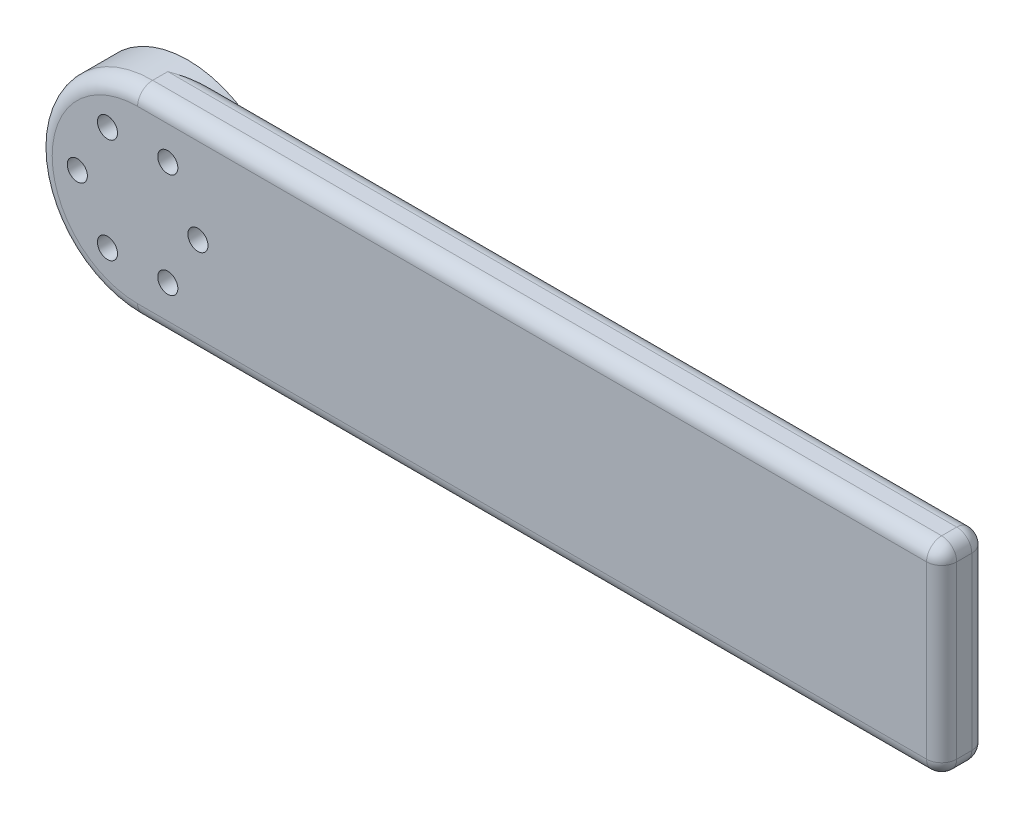
ISO-10303-21;
HEADER;
FILE_DESCRIPTION(('STEP AP214'),'2;1');
FILE_NAME('part.step','',(''),(''),'','','');
FILE_SCHEMA(('AUTOMOTIVE_DESIGN { 1 0 10303 214 1 1 1 1 }'));
ENDSEC;
DATA;
#1=APPLICATION_CONTEXT('core data for automotive mechanical design processes');
#2=APPLICATION_PROTOCOL_DEFINITION('international standard','automotive_design',2000,#1);
#3=PRODUCT_CONTEXT('',#1,'mechanical');
#4=PRODUCT('Part','Part','',(#3));
#5=PRODUCT_RELATED_PRODUCT_CATEGORY('part','',(#4));
#6=PRODUCT_DEFINITION_FORMATION('','',#4);
#7=PRODUCT_DEFINITION_CONTEXT('part definition',#1,'design');
#8=PRODUCT_DEFINITION('design','',#6,#7);
#9=PRODUCT_DEFINITION_SHAPE('','',#8);
#10=(LENGTH_UNIT() NAMED_UNIT(*) SI_UNIT(.MILLI.,.METRE.));
#11=(NAMED_UNIT(*) PLANE_ANGLE_UNIT() SI_UNIT($,.RADIAN.));
#12=(NAMED_UNIT(*) SI_UNIT($,.STERADIAN.) SOLID_ANGLE_UNIT());
#13=UNCERTAINTY_MEASURE_WITH_UNIT(LENGTH_MEASURE(1.E-05),#10,'distance_accuracy_value','');
#14=(GEOMETRIC_REPRESENTATION_CONTEXT(3) GLOBAL_UNCERTAINTY_ASSIGNED_CONTEXT((#13)) GLOBAL_UNIT_ASSIGNED_CONTEXT((#10,
#11,#12)) REPRESENTATION_CONTEXT('',''));
#15=CARTESIAN_POINT('',(0.,0.,0.));
#16=DIRECTION('',(0.,0.,1.));
#17=DIRECTION('',(1.,0.,0.));
#18=AXIS2_PLACEMENT_3D('',#15,#16,#17);
#19=CARTESIAN_POINT('',(0.,0.,10.));
#20=DIRECTION('',(0.,0.,-1.));
#21=DIRECTION('',(-1.,0.,0.));
#22=AXIS2_PLACEMENT_3D('',#19,#20,#21);
#23=CYLINDRICAL_SURFACE('',#22,20.);
#24=CARTESIAN_POINT('',(0.,0.,0.));
#25=DIRECTION('',(0.,0.,1.));
#26=DIRECTION('',(1.,0.,0.));
#27=AXIS2_PLACEMENT_3D('',#24,#25,#26);
#28=CIRCLE('',#27,20.);
#29=CARTESIAN_POINT('',(20.,0.,0.));
#30=VERTEX_POINT('',#29);
#31=EDGE_CURVE('E154',#30,#30,#28,.T.);
#32=ORIENTED_EDGE('',*,*,#31,.T.);
#33=EDGE_LOOP('',(#32));
#34=FACE_BOUND('',#33,.T.);
#35=DIRECTION('',(0.,0.,-1.));
#36=VECTOR('',#35,1.);
#37=CARTESIAN_POINT('',(0.,-20.,10.));
#38=LINE('',#37,#36);
#39=CARTESIAN_POINT('',(0.,-20.,7.));
#40=VERTEX_POINT('',#39);
#41=CARTESIAN_POINT('',(0.,-20.,4.));
#42=VERTEX_POINT('',#41);
#43=EDGE_CURVE('E145',#40,#42,#38,.T.);
#44=ORIENTED_EDGE('',*,*,#43,.F.);
#45=CARTESIAN_POINT('',(0.,0.,7.));
#46=DIRECTION('',(0.,0.,1.));
#47=DIRECTION('',(1.,0.,0.));
#48=AXIS2_PLACEMENT_3D('',#45,#46,#47);
#49=CIRCLE('',#48,20.);
#50=CARTESIAN_POINT('',(0.,20.,7.));
#51=VERTEX_POINT('',#50);
#52=EDGE_CURVE('E132',#40,#51,#49,.F.);
#53=ORIENTED_EDGE('',*,*,#52,.T.);
#54=DIRECTION('',(0.,0.,-1.));
#55=VECTOR('',#54,1.);
#56=CARTESIAN_POINT('',(0.,20.,10.));
#57=LINE('',#56,#55);
#58=CARTESIAN_POINT('',(0.,20.,4.));
#59=VERTEX_POINT('',#58);
#60=EDGE_CURVE('E155',#51,#59,#57,.T.);
#61=ORIENTED_EDGE('',*,*,#60,.T.);
#62=CARTESIAN_POINT('',(10.5356537528527,17.,1.));
#63=CARTESIAN_POINT('',(10.3911760778153,17.0895448022673,1.00002175898938));
#64=CARTESIAN_POINT('',(10.2455863992191,17.1772185302614,1.00400798103896));
#65=CARTESIAN_POINT('',(9.95255556602212,17.3486422294934,1.01908057258509));
#66=CARTESIAN_POINT('',(9.80511524112176,17.4323938846708,1.03016386440292));
#67=CARTESIAN_POINT('',(9.50896002125826,17.5956876618835,1.05857160059478));
#68=CARTESIAN_POINT('',(9.36024869594974,17.675238743086,1.07588209110883));
#69=CARTESIAN_POINT('',(9.06145164318629,17.8302672611487,1.11606731751256));
#70=CARTESIAN_POINT('',(8.91136574972451,17.9057441981785,1.13894273423974));
#71=CARTESIAN_POINT('',(8.46108504584101,18.1251502858539,1.21469696512021));
#72=CARTESIAN_POINT('',(8.15913048456193,18.2630104972367,1.27488503310374));
#73=CARTESIAN_POINT('',(7.55160111752511,18.5224881765929,1.41088904586956));
#74=CARTESIAN_POINT('',(7.24602369236116,18.6440929993286,1.48671704185396));
#75=CARTESIAN_POINT('',(6.69198454232564,18.8490527869545,1.63489397704918));
#76=CARTESIAN_POINT('',(6.4439766559942,18.9352466017832,1.70504983303014));
#77=CARTESIAN_POINT('',(5.9465838250336,19.0972922428552,1.85213231488193));
#78=CARTESIAN_POINT('',(5.69719872323811,19.1731428622616,1.92905972913324));
#79=CARTESIAN_POINT('',(4.94728357596336,19.3854166699556,2.16825660973863));
#80=CARTESIAN_POINT('',(4.44502999160687,19.5065484481745,2.33893066948318));
#81=CARTESIAN_POINT('',(3.43705349427392,19.709172391863,2.69522101783152));
#82=CARTESIAN_POINT('',(2.93132618336808,19.7905979120841,2.88086182318113));
#83=CARTESIAN_POINT('',(1.91852913864083,19.9142998143184,3.26060597241414));
#84=CARTESIAN_POINT('',(1.41146016939254,19.9565950479971,3.45470519407078));
#85=CARTESIAN_POINT('',(0.611622144785769,19.9927901364861,3.76313539451947));
#86=CARTESIAN_POINT('',(0.318990849644126,19.9995967530798,3.87645583092139));
#87=CARTESIAN_POINT('',(0.0175834672088377,19.9999942018716,3.99318995170141));
#88=CARTESIAN_POINT('',(0.00879172538854634,19.9999999988693,3.99659497865227));
#89=CARTESIAN_POINT('',(0.,20.,4.));
#90=B_SPLINE_CURVE_WITH_KNOTS('',3,(#62,#63,#64,#65,#66,#67,#68,#69,#70,#71,#72,#73,#74,#75,#76,
#77,#78,#79,#80,#81,#82,#83,#84,#85,#86,#87,#88,#89),.UNSPECIFIED.,.F.,.F.,(4,2,2,2,2,2,2,2,2,2,
2,2,2,4),(0.,0.50981143987745,1.01940194713636,1.52785760886554,2.03637550860507,
3.04745631521842,4.05931913100926,4.87432922119132,5.68943432496278,7.31976401305428,
8.95282080045305,10.5850904253084,11.5264747571758,11.5547590337701),.UNSPECIFIED.);
#91=CARTESIAN_POINT('',(10.5356537528527,17.,1.));
#92=VERTEX_POINT('',#91);
#93=EDGE_CURVE('E11',#59,#92,#90,.F.);
#94=ORIENTED_EDGE('',*,*,#93,.T.);
#95=CARTESIAN_POINT('',(0.,0.,1.));
#96=DIRECTION('',(0.,0.,1.));
#97=DIRECTION('',(1.,0.,0.));
#98=AXIS2_PLACEMENT_3D('',#95,#96,#97);
#99=CIRCLE('',#98,20.);
#100=CARTESIAN_POINT('',(10.5356537528527,-17.,1.));
#101=VERTEX_POINT('',#100);
#102=EDGE_CURVE('E160',#101,#92,#99,.T.);
#103=ORIENTED_EDGE('',*,*,#102,.F.);
#104=CARTESIAN_POINT('',(10.5356537528527,-17.,1.));
#105=CARTESIAN_POINT('',(10.3911760778153,-17.0895448022673,1.00002175898938));
#106=CARTESIAN_POINT('',(10.2455863992191,-17.1772185302614,1.00400798103896));
#107=CARTESIAN_POINT('',(9.95255556602212,-17.3486422294934,1.01908057258509));
#108=CARTESIAN_POINT('',(9.80511524112176,-17.4323938846708,1.03016386440292));
#109=CARTESIAN_POINT('',(9.50896002125826,-17.5956876618835,1.05857160059478));
#110=CARTESIAN_POINT('',(9.36024869594974,-17.675238743086,1.07588209110883));
#111=CARTESIAN_POINT('',(9.06145164318629,-17.8302672611487,1.11606731751256));
#112=CARTESIAN_POINT('',(8.91136574972451,-17.9057441981785,1.13894273423974));
#113=CARTESIAN_POINT('',(8.46108504584101,-18.1251502858539,1.21469696512021));
#114=CARTESIAN_POINT('',(8.15913048456193,-18.2630104972367,1.27488503310374));
#115=CARTESIAN_POINT('',(7.55160111752511,-18.5224881765929,1.41088904586956));
#116=CARTESIAN_POINT('',(7.24602369236116,-18.6440929993286,1.48671704185396));
#117=CARTESIAN_POINT('',(6.69198454232564,-18.8490527869545,1.63489397704918));
#118=CARTESIAN_POINT('',(6.4439766559942,-18.9352466017832,1.70504983303014));
#119=CARTESIAN_POINT('',(5.9465838250336,-19.0972922428552,1.85213231488193));
#120=CARTESIAN_POINT('',(5.69719872323811,-19.1731428622616,1.92905972913324));
#121=CARTESIAN_POINT('',(4.94728357596336,-19.3854166699556,2.16825660973863));
#122=CARTESIAN_POINT('',(4.44502999160687,-19.5065484481745,2.33893066948318));
#123=CARTESIAN_POINT('',(3.43705349427392,-19.709172391863,2.69522101783152));
#124=CARTESIAN_POINT('',(2.93132618336808,-19.7905979120841,2.88086182318113));
#125=CARTESIAN_POINT('',(1.91852913864083,-19.9142998143184,3.26060597241414));
#126=CARTESIAN_POINT('',(1.41146016939254,-19.9565950479971,3.45470519407078));
#127=CARTESIAN_POINT('',(0.611622144785769,-19.9927901364861,3.76313539451947));
#128=CARTESIAN_POINT('',(0.318990849644126,-19.9995967530798,3.87645583092139));
#129=CARTESIAN_POINT('',(0.0175834672088377,-19.9999942018716,3.99318995170141));
#130=CARTESIAN_POINT('',(0.00879172538854634,-19.9999999988693,3.99659497865227));
#131=CARTESIAN_POINT('',(0.,-20.,4.));
#132=B_SPLINE_CURVE_WITH_KNOTS('',3,(#104,#105,#106,#107,#108,#109,#110,#111,#112,#113,#114,
#115,#116,#117,#118,#119,#120,#121,#122,#123,#124,#125,#126,#127,#128,#129,#130,#131),
.UNSPECIFIED.,.F.,.F.,(4,2,2,2,2,2,2,2,2,2,2,2,2,4),(0.,0.50981143987745,1.01940194713636,
1.52785760886554,2.03637550860507,3.04745631521842,4.05931913100926,4.87432922119132,
5.68943432496278,7.31976401305428,8.95282080045305,10.5850904253084,11.5264747571758,
11.5547590337701),.UNSPECIFIED.);
#133=EDGE_CURVE('E50',#101,#42,#132,.T.);
#134=ORIENTED_EDGE('',*,*,#133,.T.);
#135=EDGE_LOOP('',(#44,#53,#61,#94,#103,#134));
#136=FACE_BOUND('',#135,.T.);
#137=ADVANCED_FACE('F40',(#34,#136),#23,.T.);
#138=CARTESIAN_POINT('',(0.,0.,10.));
#139=DIRECTION('',(0.,0.,1.));
#140=DIRECTION('',(1.,0.,0.));
#141=AXIS2_PLACEMENT_3D('',#138,#139,#140);
#142=PLANE('',#141);
#143=CARTESIAN_POINT('',(0.,0.,10.));
#144=DIRECTION('',(0.,0.,1.));
#145=DIRECTION('',(1.,0.,0.));
#146=AXIS2_PLACEMENT_3D('',#143,#144,#145);
#147=CIRCLE('',#146,17.);
#148=CARTESIAN_POINT('',(0.,17.,10.));
#149=VERTEX_POINT('',#148);
#150=CARTESIAN_POINT('',(0.,-17.,10.));
#151=VERTEX_POINT('',#150);
#152=EDGE_CURVE('E169',#149,#151,#147,.T.);
#153=ORIENTED_EDGE('',*,*,#152,.T.);
#154=DIRECTION('',(-1.,0.,0.));
#155=VECTOR('',#154,1.);
#156=CARTESIAN_POINT('',(0.,-17.,10.));
#157=LINE('',#156,#155);
#158=CARTESIAN_POINT('',(157.,-17.,10.));
#159=VERTEX_POINT('',#158);
#160=EDGE_CURVE('E126',#151,#159,#157,.F.);
#161=ORIENTED_EDGE('',*,*,#160,.T.);
#162=DIRECTION('',(0.,-1.,0.));
#163=VECTOR('',#162,1.);
#164=CARTESIAN_POINT('',(157.,0.,10.));
#165=LINE('',#164,#163);
#166=CARTESIAN_POINT('',(157.,17.,10.));
#167=VERTEX_POINT('',#166);
#168=EDGE_CURVE('E167',#159,#167,#165,.F.);
#169=ORIENTED_EDGE('',*,*,#168,.T.);
#170=DIRECTION('',(1.,0.,0.));
#171=VECTOR('',#170,1.);
#172=CARTESIAN_POINT('',(0.,17.,10.));
#173=LINE('',#172,#171);
#174=EDGE_CURVE('E150',#167,#149,#173,.F.);
#175=ORIENTED_EDGE('',*,*,#174,.T.);
#176=EDGE_LOOP('',(#153,#161,#169,#175));
#177=FACE_BOUND('',#176,.T.);
#178=CARTESIAN_POINT('',(12.,0.,10.));
#179=DIRECTION('',(0.,0.,1.));
#180=DIRECTION('',(1.,0.,0.));
#181=AXIS2_PLACEMENT_3D('',#178,#179,#180);
#182=CIRCLE('',#181,1.99999999999999);
#183=CARTESIAN_POINT('',(14.,0.,10.));
#184=VERTEX_POINT('',#183);
#185=EDGE_CURVE('E283',#184,#184,#182,.T.);
#186=ORIENTED_EDGE('',*,*,#185,.F.);
#187=EDGE_LOOP('',(#186));
#188=FACE_BOUND('',#187,.T.);
#189=CARTESIAN_POINT('',(5.99999999999998,-10.3923048454133,10.));
#190=DIRECTION('',(0.,0.,1.));
#191=DIRECTION('',(1.,0.,0.));
#192=AXIS2_PLACEMENT_3D('',#189,#190,#191);
#193=CIRCLE('',#192,1.99999999999999);
#194=CARTESIAN_POINT('',(7.99999999999996,-10.3923048454133,10.));
#195=VERTEX_POINT('',#194);
#196=EDGE_CURVE('E286',#195,#195,#193,.T.);
#197=ORIENTED_EDGE('',*,*,#196,.F.);
#198=EDGE_LOOP('',(#197));
#199=FACE_BOUND('',#198,.T.);
#200=CARTESIAN_POINT('',(-6.00000000000005,-10.3923048454132,10.));
#201=DIRECTION('',(0.,0.,1.));
#202=DIRECTION('',(1.,0.,0.));
#203=AXIS2_PLACEMENT_3D('',#200,#201,#202);
#204=CIRCLE('',#203,1.99999999999999);
#205=CARTESIAN_POINT('',(-4.00000000000006,-10.3923048454132,10.));
#206=VERTEX_POINT('',#205);
#207=EDGE_CURVE('E296',#206,#206,#204,.T.);
#208=ORIENTED_EDGE('',*,*,#207,.F.);
#209=EDGE_LOOP('',(#208));
#210=FACE_BOUND('',#209,.T.);
#211=CARTESIAN_POINT('',(-12.,0.,10.));
#212=DIRECTION('',(0.,0.,1.));
#213=DIRECTION('',(1.,0.,0.));
#214=AXIS2_PLACEMENT_3D('',#211,#212,#213);
#215=CIRCLE('',#214,1.99999999999999);
#216=CARTESIAN_POINT('',(-10.,0.,10.));
#217=VERTEX_POINT('',#216);
#218=EDGE_CURVE('E302',#217,#217,#215,.T.);
#219=ORIENTED_EDGE('',*,*,#218,.F.);
#220=EDGE_LOOP('',(#219));
#221=FACE_BOUND('',#220,.T.);
#222=CARTESIAN_POINT('',(-5.99999999999991,10.3923048454133,10.));
#223=DIRECTION('',(0.,0.,1.));
#224=DIRECTION('',(1.,0.,0.));
#225=AXIS2_PLACEMENT_3D('',#222,#223,#224);
#226=CIRCLE('',#225,1.99999999999999);
#227=CARTESIAN_POINT('',(-3.99999999999992,10.3923048454133,10.));
#228=VERTEX_POINT('',#227);
#229=EDGE_CURVE('E308',#228,#228,#226,.T.);
#230=ORIENTED_EDGE('',*,*,#229,.F.);
#231=EDGE_LOOP('',(#230));
#232=FACE_BOUND('',#231,.T.);
#233=CARTESIAN_POINT('',(6.00000000000012,10.3923048454132,10.));
#234=DIRECTION('',(0.,0.,1.));
#235=DIRECTION('',(1.,0.,0.));
#236=AXIS2_PLACEMENT_3D('',#233,#234,#235);
#237=CIRCLE('',#236,1.99999999999999);
#238=CARTESIAN_POINT('',(8.00000000000011,10.3923048454132,10.));
#239=VERTEX_POINT('',#238);
#240=EDGE_CURVE('E314',#239,#239,#237,.T.);
#241=ORIENTED_EDGE('',*,*,#240,.F.);
#242=EDGE_LOOP('',(#241));
#243=FACE_BOUND('',#242,.T.);
#244=ADVANCED_FACE('F224',(#177,#188,#199,#210,#221,#232,#243),#142,.T.);
#245=CARTESIAN_POINT('',(0.,0.,0.));
#246=DIRECTION('',(0.,0.,1.));
#247=DIRECTION('',(1.,0.,0.));
#248=AXIS2_PLACEMENT_3D('',#245,#246,#247);
#249=PLANE('',#248);
#250=CARTESIAN_POINT('',(12.,0.,0.));
#251=DIRECTION('',(0.,0.,1.));
#252=DIRECTION('',(1.,0.,0.));
#253=AXIS2_PLACEMENT_3D('',#250,#251,#252);
#254=CIRCLE('',#253,1.99999999999999);
#255=CARTESIAN_POINT('',(14.,0.,0.));
#256=VERTEX_POINT('',#255);
#257=EDGE_CURVE('E280',#256,#256,#254,.T.);
#258=ORIENTED_EDGE('',*,*,#257,.T.);
#259=EDGE_LOOP('',(#258));
#260=FACE_BOUND('',#259,.T.);
#261=CARTESIAN_POINT('',(5.99999999999998,-10.3923048454133,0.));
#262=DIRECTION('',(0.,0.,1.));
#263=DIRECTION('',(1.,0.,0.));
#264=AXIS2_PLACEMENT_3D('',#261,#262,#263);
#265=CIRCLE('',#264,1.99999999999999);
#266=CARTESIAN_POINT('',(7.99999999999996,-10.3923048454133,0.));
#267=VERTEX_POINT('',#266);
#268=EDGE_CURVE('E293',#267,#267,#265,.T.);
#269=ORIENTED_EDGE('',*,*,#268,.T.);
#270=EDGE_LOOP('',(#269));
#271=FACE_BOUND('',#270,.T.);
#272=CARTESIAN_POINT('',(-6.00000000000005,-10.3923048454132,0.));
#273=DIRECTION('',(0.,0.,1.));
#274=DIRECTION('',(1.,0.,0.));
#275=AXIS2_PLACEMENT_3D('',#272,#273,#274);
#276=CIRCLE('',#275,1.99999999999999);
#277=CARTESIAN_POINT('',(-4.00000000000006,-10.3923048454132,0.));
#278=VERTEX_POINT('',#277);
#279=EDGE_CURVE('E299',#278,#278,#276,.T.);
#280=ORIENTED_EDGE('',*,*,#279,.T.);
#281=EDGE_LOOP('',(#280));
#282=FACE_BOUND('',#281,.T.);
#283=CARTESIAN_POINT('',(-12.,0.,0.));
#284=DIRECTION('',(0.,0.,1.));
#285=DIRECTION('',(1.,0.,0.));
#286=AXIS2_PLACEMENT_3D('',#283,#284,#285);
#287=CIRCLE('',#286,1.99999999999999);
#288=CARTESIAN_POINT('',(-10.,0.,0.));
#289=VERTEX_POINT('',#288);
#290=EDGE_CURVE('E305',#289,#289,#287,.T.);
#291=ORIENTED_EDGE('',*,*,#290,.T.);
#292=EDGE_LOOP('',(#291));
#293=FACE_BOUND('',#292,.T.);
#294=CARTESIAN_POINT('',(-5.99999999999991,10.3923048454133,0.));
#295=DIRECTION('',(0.,0.,1.));
#296=DIRECTION('',(1.,0.,0.));
#297=AXIS2_PLACEMENT_3D('',#294,#295,#296);
#298=CIRCLE('',#297,1.99999999999999);
#299=CARTESIAN_POINT('',(-3.99999999999992,10.3923048454133,0.));
#300=VERTEX_POINT('',#299);
#301=EDGE_CURVE('E311',#300,#300,#298,.T.);
#302=ORIENTED_EDGE('',*,*,#301,.T.);
#303=EDGE_LOOP('',(#302));
#304=FACE_BOUND('',#303,.T.);
#305=CARTESIAN_POINT('',(6.00000000000012,10.3923048454132,0.));
#306=DIRECTION('',(0.,0.,1.));
#307=DIRECTION('',(1.,0.,0.));
#308=AXIS2_PLACEMENT_3D('',#305,#306,#307);
#309=CIRCLE('',#308,1.99999999999999);
#310=CARTESIAN_POINT('',(8.00000000000011,10.3923048454132,0.));
#311=VERTEX_POINT('',#310);
#312=EDGE_CURVE('E317',#311,#311,#309,.T.);
#313=ORIENTED_EDGE('',*,*,#312,.T.);
#314=EDGE_LOOP('',(#313));
#315=FACE_BOUND('',#314,.T.);
#316=ORIENTED_EDGE('',*,*,#31,.F.);
#317=EDGE_LOOP('',(#316));
#318=FACE_BOUND('',#317,.T.);
#319=ADVANCED_FACE('F230',(#260,#271,#282,#293,#304,#315,#318),#249,.F.);
#320=CARTESIAN_POINT('',(0.,-20.,10.));
#321=DIRECTION('',(0.,-1.,0.));
#322=DIRECTION('',(0.,0.,-1.));
#323=AXIS2_PLACEMENT_3D('',#320,#321,#322);
#324=PLANE('',#323);
#325=DIRECTION('',(0.,0.,-1.));
#326=VECTOR('',#325,1.);
#327=CARTESIAN_POINT('',(157.,-20.,10.));
#328=LINE('',#327,#326);
#329=CARTESIAN_POINT('',(157.,-20.,4.));
#330=VERTEX_POINT('',#329);
#331=CARTESIAN_POINT('',(157.,-20.,7.));
#332=VERTEX_POINT('',#331);
#333=EDGE_CURVE('E148',#330,#332,#328,.F.);
#334=ORIENTED_EDGE('',*,*,#333,.T.);
#335=DIRECTION('',(-1.,0.,0.));
#336=VECTOR('',#335,1.);
#337=CARTESIAN_POINT('',(0.,-20.,7.));
#338=LINE('',#337,#336);
#339=EDGE_CURVE('E124',#332,#40,#338,.T.);
#340=ORIENTED_EDGE('',*,*,#339,.T.);
#341=ORIENTED_EDGE('',*,*,#43,.T.);
#342=DIRECTION('',(-1.,0.,0.));
#343=VECTOR('',#342,1.);
#344=CARTESIAN_POINT('',(160.,-20.,4.));
#345=LINE('',#344,#343);
#346=EDGE_CURVE('E158',#42,#330,#345,.F.);
#347=ORIENTED_EDGE('',*,*,#346,.T.);
#348=EDGE_LOOP('',(#334,#340,#341,#347));
#349=FACE_BOUND('',#348,.T.);
#350=ADVANCED_FACE('F144',(#349),#324,.T.);
#351=CARTESIAN_POINT('',(160.,0.,10.));
#352=DIRECTION('',(1.,0.,0.));
#353=DIRECTION('',(0.,0.,-1.));
#354=AXIS2_PLACEMENT_3D('',#351,#352,#353);
#355=PLANE('',#354);
#356=DIRECTION('',(0.,0.,-1.));
#357=VECTOR('',#356,1.);
#358=CARTESIAN_POINT('',(160.,-17.,10.));
#359=LINE('',#358,#357);
#360=CARTESIAN_POINT('',(160.,-17.,7.));
#361=VERTEX_POINT('',#360);
#362=CARTESIAN_POINT('',(160.,-17.,4.));
#363=VERTEX_POINT('',#362);
#364=EDGE_CURVE('E175',#361,#363,#359,.T.);
#365=ORIENTED_EDGE('',*,*,#364,.T.);
#366=DIRECTION('',(0.,-1.,0.));
#367=VECTOR('',#366,1.);
#368=CARTESIAN_POINT('',(160.,20.,4.));
#369=LINE('',#368,#367);
#370=CARTESIAN_POINT('',(160.,17.,4.));
#371=VERTEX_POINT('',#370);
#372=EDGE_CURVE('E178',#363,#371,#369,.F.);
#373=ORIENTED_EDGE('',*,*,#372,.T.);
#374=DIRECTION('',(0.,0.,-1.));
#375=VECTOR('',#374,1.);
#376=CARTESIAN_POINT('',(160.,17.,10.));
#377=LINE('',#376,#375);
#378=CARTESIAN_POINT('',(160.,17.,7.));
#379=VERTEX_POINT('',#378);
#380=EDGE_CURVE('E173',#371,#379,#377,.F.);
#381=ORIENTED_EDGE('',*,*,#380,.T.);
#382=DIRECTION('',(0.,-1.,0.));
#383=VECTOR('',#382,1.);
#384=CARTESIAN_POINT('',(160.,0.,7.));
#385=LINE('',#384,#383);
#386=EDGE_CURVE('E140',#379,#361,#385,.T.);
#387=ORIENTED_EDGE('',*,*,#386,.T.);
#388=EDGE_LOOP('',(#365,#373,#381,#387));
#389=FACE_BOUND('',#388,.T.);
#390=ADVANCED_FACE('F241',(#389),#355,.T.);
#391=CARTESIAN_POINT('',(0.,20.,10.));
#392=DIRECTION('',(0.,1.,0.));
#393=DIRECTION('',(0.,0.,1.));
#394=AXIS2_PLACEMENT_3D('',#391,#392,#393);
#395=PLANE('',#394);
#396=ORIENTED_EDGE('',*,*,#60,.F.);
#397=DIRECTION('',(1.,0.,0.));
#398=VECTOR('',#397,1.);
#399=CARTESIAN_POINT('',(0.,20.,7.));
#400=LINE('',#399,#398);
#401=CARTESIAN_POINT('',(157.,20.,7.));
#402=VERTEX_POINT('',#401);
#403=EDGE_CURVE('E184',#51,#402,#400,.T.);
#404=ORIENTED_EDGE('',*,*,#403,.T.);
#405=DIRECTION('',(0.,0.,-1.));
#406=VECTOR('',#405,1.);
#407=CARTESIAN_POINT('',(157.,20.,10.));
#408=LINE('',#407,#406);
#409=CARTESIAN_POINT('',(157.,20.,4.));
#410=VERTEX_POINT('',#409);
#411=EDGE_CURVE('E182',#402,#410,#408,.T.);
#412=ORIENTED_EDGE('',*,*,#411,.T.);
#413=DIRECTION('',(1.,0.,0.));
#414=VECTOR('',#413,1.);
#415=CARTESIAN_POINT('',(0.,20.,4.));
#416=LINE('',#415,#414);
#417=EDGE_CURVE('E180',#410,#59,#416,.F.);
#418=ORIENTED_EDGE('',*,*,#417,.T.);
#419=EDGE_LOOP('',(#396,#404,#412,#418));
#420=FACE_BOUND('',#419,.T.);
#421=ADVANCED_FACE('F248',(#420),#395,.T.);
#422=CARTESIAN_POINT('',(0.,0.,1.));
#423=DIRECTION('',(0.,0.,1.));
#424=DIRECTION('',(1.,0.,0.));
#425=AXIS2_PLACEMENT_3D('',#422,#423,#424);
#426=PLANE('',#425);
#427=DIRECTION('',(0.,-1.,0.));
#428=VECTOR('',#427,1.);
#429=CARTESIAN_POINT('',(157.,-20.,1.));
#430=LINE('',#429,#428);
#431=CARTESIAN_POINT('',(157.,17.,1.));
#432=VERTEX_POINT('',#431);
#433=CARTESIAN_POINT('',(157.,-17.,1.));
#434=VERTEX_POINT('',#433);
#435=EDGE_CURVE('E58',#432,#434,#430,.T.);
#436=ORIENTED_EDGE('',*,*,#435,.T.);
#437=DIRECTION('',(-1.,0.,0.));
#438=VECTOR('',#437,1.);
#439=CARTESIAN_POINT('',(0.,-17.,1.));
#440=LINE('',#439,#438);
#441=EDGE_CURVE('E188',#434,#101,#440,.T.);
#442=ORIENTED_EDGE('',*,*,#441,.T.);
#443=ORIENTED_EDGE('',*,*,#102,.T.);
#444=DIRECTION('',(1.,0.,0.));
#445=VECTOR('',#444,1.);
#446=CARTESIAN_POINT('',(160.,17.,1.));
#447=LINE('',#446,#445);
#448=EDGE_CURVE('E63',#92,#432,#447,.T.);
#449=ORIENTED_EDGE('',*,*,#448,.T.);
#450=EDGE_LOOP('',(#436,#442,#443,#449));
#451=FACE_BOUND('',#450,.T.);
#452=ADVANCED_FACE('F252',(#451),#426,.F.);
#453=CARTESIAN_POINT('',(6.00000000000012,10.3923048454132,10.));
#454=DIRECTION('',(0.,0.,1.));
#455=DIRECTION('',(1.,0.,0.));
#456=AXIS2_PLACEMENT_3D('',#453,#454,#455);
#457=CYLINDRICAL_SURFACE('',#456,1.99999999999999);
#458=ORIENTED_EDGE('',*,*,#312,.F.);
#459=EDGE_LOOP('',(#458));
#460=FACE_BOUND('',#459,.T.);
#461=ORIENTED_EDGE('',*,*,#240,.T.);
#462=EDGE_LOOP('',(#461));
#463=FACE_BOUND('',#462,.T.);
#464=ADVANCED_FACE('F256',(#460,#463),#457,.F.);
#465=CARTESIAN_POINT('',(-5.99999999999991,10.3923048454133,10.));
#466=DIRECTION('',(0.,0.,1.));
#467=DIRECTION('',(1.,0.,0.));
#468=AXIS2_PLACEMENT_3D('',#465,#466,#467);
#469=CYLINDRICAL_SURFACE('',#468,1.99999999999999);
#470=ORIENTED_EDGE('',*,*,#301,.F.);
#471=EDGE_LOOP('',(#470));
#472=FACE_BOUND('',#471,.T.);
#473=ORIENTED_EDGE('',*,*,#229,.T.);
#474=EDGE_LOOP('',(#473));
#475=FACE_BOUND('',#474,.T.);
#476=ADVANCED_FACE('F258',(#472,#475),#469,.F.);
#477=CARTESIAN_POINT('',(-12.,0.,10.));
#478=DIRECTION('',(0.,0.,1.));
#479=DIRECTION('',(1.,0.,0.));
#480=AXIS2_PLACEMENT_3D('',#477,#478,#479);
#481=CYLINDRICAL_SURFACE('',#480,1.99999999999999);
#482=ORIENTED_EDGE('',*,*,#290,.F.);
#483=EDGE_LOOP('',(#482));
#484=FACE_BOUND('',#483,.T.);
#485=ORIENTED_EDGE('',*,*,#218,.T.);
#486=EDGE_LOOP('',(#485));
#487=FACE_BOUND('',#486,.T.);
#488=ADVANCED_FACE('F262',(#484,#487),#481,.F.);
#489=CARTESIAN_POINT('',(-6.00000000000005,-10.3923048454132,10.));
#490=DIRECTION('',(0.,0.,1.));
#491=DIRECTION('',(1.,0.,0.));
#492=AXIS2_PLACEMENT_3D('',#489,#490,#491);
#493=CYLINDRICAL_SURFACE('',#492,1.99999999999999);
#494=ORIENTED_EDGE('',*,*,#279,.F.);
#495=EDGE_LOOP('',(#494));
#496=FACE_BOUND('',#495,.T.);
#497=ORIENTED_EDGE('',*,*,#207,.T.);
#498=EDGE_LOOP('',(#497));
#499=FACE_BOUND('',#498,.T.);
#500=ADVANCED_FACE('F266',(#496,#499),#493,.F.);
#501=CARTESIAN_POINT('',(5.99999999999998,-10.3923048454133,10.));
#502=DIRECTION('',(0.,0.,1.));
#503=DIRECTION('',(1.,0.,0.));
#504=AXIS2_PLACEMENT_3D('',#501,#502,#503);
#505=CYLINDRICAL_SURFACE('',#504,1.99999999999999);
#506=ORIENTED_EDGE('',*,*,#268,.F.);
#507=EDGE_LOOP('',(#506));
#508=FACE_BOUND('',#507,.T.);
#509=ORIENTED_EDGE('',*,*,#196,.T.);
#510=EDGE_LOOP('',(#509));
#511=FACE_BOUND('',#510,.T.);
#512=ADVANCED_FACE('F270',(#508,#511),#505,.F.);
#513=CARTESIAN_POINT('',(12.,0.,10.));
#514=DIRECTION('',(0.,0.,1.));
#515=DIRECTION('',(1.,0.,0.));
#516=AXIS2_PLACEMENT_3D('',#513,#514,#515);
#517=CYLINDRICAL_SURFACE('',#516,1.99999999999999);
#518=ORIENTED_EDGE('',*,*,#257,.F.);
#519=EDGE_LOOP('',(#518));
#520=FACE_BOUND('',#519,.T.);
#521=ORIENTED_EDGE('',*,*,#185,.T.);
#522=EDGE_LOOP('',(#521));
#523=FACE_BOUND('',#522,.T.);
#524=ADVANCED_FACE('F220',(#520,#523),#517,.F.);
#525=CARTESIAN_POINT('',(0.,17.,4.));
#526=DIRECTION('',(-1.,0.,0.));
#527=DIRECTION('',(0.,0.,1.));
#528=AXIS2_PLACEMENT_3D('',#525,#526,#527);
#529=CYLINDRICAL_SURFACE('',#528,3.);
#530=CARTESIAN_POINT('',(157.,17.,4.));
#531=DIRECTION('',(1.,0.,0.));
#532=DIRECTION('',(0.,0.,-1.));
#533=AXIS2_PLACEMENT_3D('',#530,#531,#532);
#534=CIRCLE('',#533,3.);
#535=EDGE_CURVE('E45',#432,#410,#534,.T.);
#536=ORIENTED_EDGE('',*,*,#535,.F.);
#537=ORIENTED_EDGE('',*,*,#448,.F.);
#538=ORIENTED_EDGE('',*,*,#93,.F.);
#539=ORIENTED_EDGE('',*,*,#417,.F.);
#540=EDGE_LOOP('',(#536,#537,#538,#539));
#541=FACE_BOUND('',#540,.T.);
#542=ADVANCED_FACE('F42',(#541),#529,.T.);
#543=CARTESIAN_POINT('',(157.,17.,4.));
#544=DIRECTION('',(0.,0.,-1.));
#545=DIRECTION('',(-1.,0.,0.));
#546=AXIS2_PLACEMENT_3D('',#543,#544,#545);
#547=SPHERICAL_SURFACE('',#546,3.);
#548=CARTESIAN_POINT('',(157.,17.,4.));
#549=DIRECTION('',(0.,0.,-1.));
#550=DIRECTION('',(-1.,0.,0.));
#551=AXIS2_PLACEMENT_3D('',#548,#549,#550);
#552=CIRCLE('',#551,3.);
#553=EDGE_CURVE('E324',#371,#410,#552,.F.);
#554=ORIENTED_EDGE('',*,*,#553,.F.);
#555=CARTESIAN_POINT('',(157.,17.,4.));
#556=DIRECTION('',(0.,1.,0.));
#557=DIRECTION('',(0.,0.,1.));
#558=AXIS2_PLACEMENT_3D('',#555,#556,#557);
#559=CIRCLE('',#558,3.);
#560=EDGE_CURVE('E289',#432,#371,#559,.F.);
#561=ORIENTED_EDGE('',*,*,#560,.F.);
#562=ORIENTED_EDGE('',*,*,#535,.T.);
#563=EDGE_LOOP('',(#554,#561,#562));
#564=FACE_BOUND('',#563,.T.);
#565=ADVANCED_FACE('F213',(#564),#547,.T.);
#566=CARTESIAN_POINT('',(157.,0.,4.));
#567=DIRECTION('',(0.,1.,0.));
#568=DIRECTION('',(0.,0.,1.));
#569=AXIS2_PLACEMENT_3D('',#566,#567,#568);
#570=CYLINDRICAL_SURFACE('',#569,3.);
#571=ORIENTED_EDGE('',*,*,#560,.T.);
#572=ORIENTED_EDGE('',*,*,#372,.F.);
#573=CARTESIAN_POINT('',(157.,-17.,4.));
#574=DIRECTION('',(0.,-1.,0.));
#575=DIRECTION('',(0.,0.,-1.));
#576=AXIS2_PLACEMENT_3D('',#573,#574,#575);
#577=CIRCLE('',#576,3.);
#578=EDGE_CURVE('E329',#434,#363,#577,.T.);
#579=ORIENTED_EDGE('',*,*,#578,.F.);
#580=ORIENTED_EDGE('',*,*,#435,.F.);
#581=EDGE_LOOP('',(#571,#572,#579,#580));
#582=FACE_BOUND('',#581,.T.);
#583=ADVANCED_FACE('F209',(#582),#570,.T.);
#584=CARTESIAN_POINT('',(0.,-17.,4.));
#585=DIRECTION('',(1.,0.,0.));
#586=DIRECTION('',(0.,0.,-1.));
#587=AXIS2_PLACEMENT_3D('',#584,#585,#586);
#588=CYLINDRICAL_SURFACE('',#587,3.);
#589=ORIENTED_EDGE('',*,*,#133,.F.);
#590=ORIENTED_EDGE('',*,*,#441,.F.);
#591=CARTESIAN_POINT('',(157.,-17.,4.));
#592=DIRECTION('',(1.,0.,0.));
#593=DIRECTION('',(0.,0.,-1.));
#594=AXIS2_PLACEMENT_3D('',#591,#592,#593);
#595=CIRCLE('',#594,3.);
#596=EDGE_CURVE('E333',#330,#434,#595,.T.);
#597=ORIENTED_EDGE('',*,*,#596,.F.);
#598=ORIENTED_EDGE('',*,*,#346,.F.);
#599=EDGE_LOOP('',(#589,#590,#597,#598));
#600=FACE_BOUND('',#599,.T.);
#601=ADVANCED_FACE('F203',(#600),#588,.T.);
#602=CARTESIAN_POINT('',(157.,17.,10.));
#603=DIRECTION('',(0.,0.,-1.));
#604=DIRECTION('',(-1.,0.,0.));
#605=AXIS2_PLACEMENT_3D('',#602,#603,#604);
#606=CYLINDRICAL_SURFACE('',#605,3.);
#607=ORIENTED_EDGE('',*,*,#553,.T.);
#608=ORIENTED_EDGE('',*,*,#411,.F.);
#609=CARTESIAN_POINT('',(157.,17.,7.));
#610=DIRECTION('',(0.,0.,1.));
#611=DIRECTION('',(1.,0.,0.));
#612=AXIS2_PLACEMENT_3D('',#609,#610,#611);
#613=CIRCLE('',#612,3.);
#614=EDGE_CURVE('E338',#379,#402,#613,.T.);
#615=ORIENTED_EDGE('',*,*,#614,.F.);
#616=ORIENTED_EDGE('',*,*,#380,.F.);
#617=EDGE_LOOP('',(#607,#608,#615,#616));
#618=FACE_BOUND('',#617,.T.);
#619=ADVANCED_FACE('F208',(#618),#606,.T.);
#620=CARTESIAN_POINT('',(157.,-17.,4.));
#621=DIRECTION('',(0.,0.,-1.));
#622=DIRECTION('',(-1.,0.,0.));
#623=AXIS2_PLACEMENT_3D('',#620,#621,#622);
#624=SPHERICAL_SURFACE('',#623,3.);
#625=ORIENTED_EDGE('',*,*,#596,.T.);
#626=ORIENTED_EDGE('',*,*,#578,.T.);
#627=CARTESIAN_POINT('',(157.,-17.,4.));
#628=DIRECTION('',(0.,0.,-1.));
#629=DIRECTION('',(-1.,0.,0.));
#630=AXIS2_PLACEMENT_3D('',#627,#628,#629);
#631=CIRCLE('',#630,3.);
#632=EDGE_CURVE('E337',#330,#363,#631,.F.);
#633=ORIENTED_EDGE('',*,*,#632,.F.);
#634=EDGE_LOOP('',(#625,#626,#633));
#635=FACE_BOUND('',#634,.T.);
#636=ADVANCED_FACE('F336',(#635),#624,.T.);
#637=CARTESIAN_POINT('',(157.,17.,7.));
#638=DIRECTION('',(1.,0.,0.));
#639=DIRECTION('',(0.,0.,-1.));
#640=AXIS2_PLACEMENT_3D('',#637,#638,#639);
#641=SPHERICAL_SURFACE('',#640,3.);
#642=CARTESIAN_POINT('',(157.,17.,7.));
#643=DIRECTION('',(1.,0.,0.));
#644=DIRECTION('',(0.,0.,-1.));
#645=AXIS2_PLACEMENT_3D('',#642,#643,#644);
#646=CIRCLE('',#645,3.);
#647=EDGE_CURVE('E364',#167,#402,#646,.F.);
#648=ORIENTED_EDGE('',*,*,#647,.F.);
#649=CARTESIAN_POINT('',(157.,17.,7.));
#650=DIRECTION('',(0.,1.,0.));
#651=DIRECTION('',(0.,0.,1.));
#652=AXIS2_PLACEMENT_3D('',#649,#650,#651);
#653=CIRCLE('',#652,3.);
#654=EDGE_CURVE('E341',#379,#167,#653,.F.);
#655=ORIENTED_EDGE('',*,*,#654,.F.);
#656=ORIENTED_EDGE('',*,*,#614,.T.);
#657=EDGE_LOOP('',(#648,#655,#656));
#658=FACE_BOUND('',#657,.T.);
#659=ADVANCED_FACE('F376',(#658),#641,.T.);
#660=CARTESIAN_POINT('',(157.,0.,7.));
#661=DIRECTION('',(0.,-1.,0.));
#662=DIRECTION('',(0.,0.,-1.));
#663=AXIS2_PLACEMENT_3D('',#660,#661,#662);
#664=CYLINDRICAL_SURFACE('',#663,3.);
#665=ORIENTED_EDGE('',*,*,#654,.T.);
#666=ORIENTED_EDGE('',*,*,#168,.F.);
#667=CARTESIAN_POINT('',(157.,-17.,7.));
#668=DIRECTION('',(0.,-1.,0.));
#669=DIRECTION('',(0.,0.,-1.));
#670=AXIS2_PLACEMENT_3D('',#667,#668,#669);
#671=CIRCLE('',#670,3.);
#672=EDGE_CURVE('E360',#361,#159,#671,.T.);
#673=ORIENTED_EDGE('',*,*,#672,.F.);
#674=ORIENTED_EDGE('',*,*,#386,.F.);
#675=EDGE_LOOP('',(#665,#666,#673,#674));
#676=FACE_BOUND('',#675,.T.);
#677=ADVANCED_FACE('F362',(#676),#664,.T.);
#678=CARTESIAN_POINT('',(157.,-17.,10.));
#679=DIRECTION('',(0.,0.,-1.));
#680=DIRECTION('',(-1.,0.,0.));
#681=AXIS2_PLACEMENT_3D('',#678,#679,#680);
#682=CYLINDRICAL_SURFACE('',#681,3.);
#683=ORIENTED_EDGE('',*,*,#632,.T.);
#684=ORIENTED_EDGE('',*,*,#364,.F.);
#685=CARTESIAN_POINT('',(157.,-17.,7.));
#686=DIRECTION('',(0.,0.,1.));
#687=DIRECTION('',(1.,0.,0.));
#688=AXIS2_PLACEMENT_3D('',#685,#686,#687);
#689=CIRCLE('',#688,3.);
#690=EDGE_CURVE('E355',#332,#361,#689,.T.);
#691=ORIENTED_EDGE('',*,*,#690,.F.);
#692=ORIENTED_EDGE('',*,*,#333,.F.);
#693=EDGE_LOOP('',(#683,#684,#691,#692));
#694=FACE_BOUND('',#693,.T.);
#695=ADVANCED_FACE('F353',(#694),#682,.T.);
#696=CARTESIAN_POINT('',(0.,17.,7.));
#697=DIRECTION('',(1.,0.,0.));
#698=DIRECTION('',(0.,0.,-1.));
#699=AXIS2_PLACEMENT_3D('',#696,#697,#698);
#700=CYLINDRICAL_SURFACE('',#699,3.);
#701=ORIENTED_EDGE('',*,*,#647,.T.);
#702=ORIENTED_EDGE('',*,*,#403,.F.);
#703=CARTESIAN_POINT('',(0.,17.,7.));
#704=DIRECTION('',(-1.,0.,0.));
#705=DIRECTION('',(0.,0.,1.));
#706=AXIS2_PLACEMENT_3D('',#703,#704,#705);
#707=CIRCLE('',#706,3.);
#708=EDGE_CURVE('E135',#149,#51,#707,.T.);
#709=ORIENTED_EDGE('',*,*,#708,.F.);
#710=ORIENTED_EDGE('',*,*,#174,.F.);
#711=EDGE_LOOP('',(#701,#702,#709,#710));
#712=FACE_BOUND('',#711,.T.);
#713=ADVANCED_FACE('F379',(#712),#700,.T.);
#714=CARTESIAN_POINT('',(157.,-17.,7.));
#715=DIRECTION('',(1.,0.,0.));
#716=DIRECTION('',(0.,0.,-1.));
#717=AXIS2_PLACEMENT_3D('',#714,#715,#716);
#718=SPHERICAL_SURFACE('',#717,3.);
#719=ORIENTED_EDGE('',*,*,#690,.T.);
#720=ORIENTED_EDGE('',*,*,#672,.T.);
#721=CARTESIAN_POINT('',(157.,-17.,7.));
#722=DIRECTION('',(1.,0.,0.));
#723=DIRECTION('',(0.,0.,-1.));
#724=AXIS2_PLACEMENT_3D('',#721,#722,#723);
#725=CIRCLE('',#724,3.);
#726=EDGE_CURVE('E129',#332,#159,#725,.F.);
#727=ORIENTED_EDGE('',*,*,#726,.F.);
#728=EDGE_LOOP('',(#719,#720,#727));
#729=FACE_BOUND('',#728,.T.);
#730=ADVANCED_FACE('F366',(#729),#718,.T.);
#731=CARTESIAN_POINT('',(0.,0.,7.));
#732=DIRECTION('',(0.,0.,1.));
#733=DIRECTION('',(1.,0.,0.));
#734=AXIS2_PLACEMENT_3D('',#731,#732,#733);
#735=TOROIDAL_SURFACE('',#734,17.,3.);
#736=ORIENTED_EDGE('',*,*,#708,.T.);
#737=ORIENTED_EDGE('',*,*,#52,.F.);
#738=CARTESIAN_POINT('',(0.,-17.,7.));
#739=DIRECTION('',(1.,0.,0.));
#740=DIRECTION('',(0.,0.,-1.));
#741=AXIS2_PLACEMENT_3D('',#738,#739,#740);
#742=CIRCLE('',#741,3.);
#743=EDGE_CURVE('E120',#151,#40,#742,.T.);
#744=ORIENTED_EDGE('',*,*,#743,.F.);
#745=ORIENTED_EDGE('',*,*,#152,.F.);
#746=EDGE_LOOP('',(#736,#737,#744,#745));
#747=FACE_BOUND('',#746,.T.);
#748=ADVANCED_FACE('F133',(#747),#735,.T.);
#749=CARTESIAN_POINT('',(0.,-17.,7.));
#750=DIRECTION('',(-1.,0.,0.));
#751=DIRECTION('',(0.,0.,1.));
#752=AXIS2_PLACEMENT_3D('',#749,#750,#751);
#753=CYLINDRICAL_SURFACE('',#752,3.);
#754=ORIENTED_EDGE('',*,*,#726,.T.);
#755=ORIENTED_EDGE('',*,*,#160,.F.);
#756=ORIENTED_EDGE('',*,*,#743,.T.);
#757=ORIENTED_EDGE('',*,*,#339,.F.);
#758=EDGE_LOOP('',(#754,#755,#756,#757));
#759=FACE_BOUND('',#758,.T.);
#760=ADVANCED_FACE('F122',(#759),#753,.T.);
#761=CLOSED_SHELL('',(#137,#244,#319,#350,#390,#421,#452,#464,#476,#488,#500,#512,#524,#542,
#565,#583,#601,#619,#636,#659,#677,#695,#713,#730,#748,#760));
#762=MANIFOLD_SOLID_BREP('B2',#761);
#763=ADVANCED_BREP_SHAPE_REPRESENTATION('',(#18,#762),#14);
#764=SHAPE_DEFINITION_REPRESENTATION(#9,#763);
ENDSEC;
END-ISO-10303-21;
